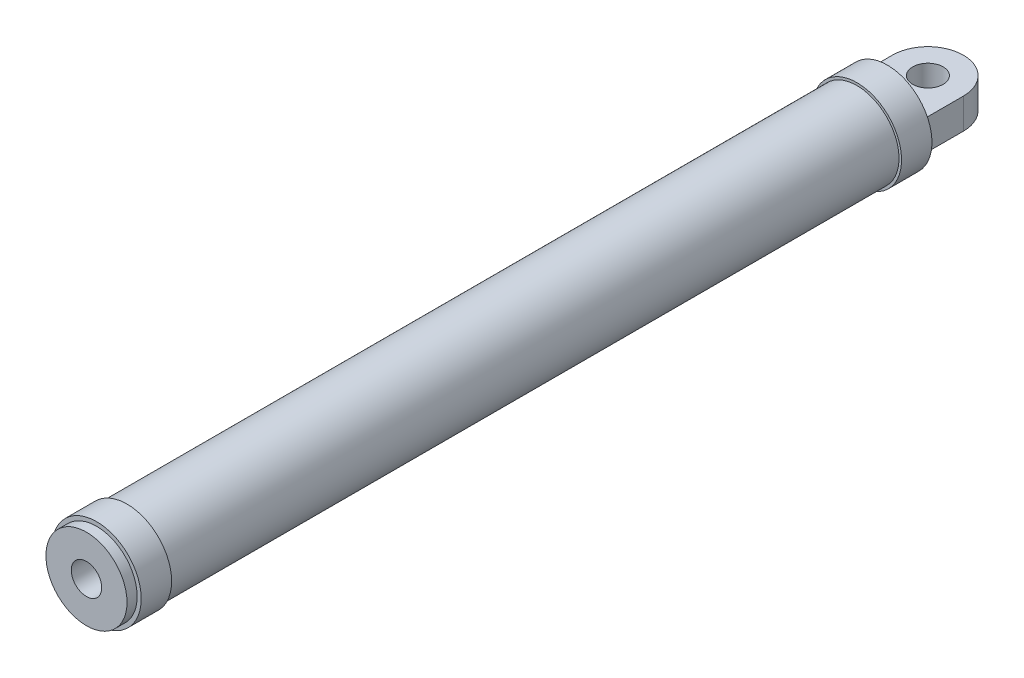
ISO-10303-21;
HEADER;
FILE_DESCRIPTION(('STEP AP214'),'2;1');
FILE_NAME('part.step','',(''),(''),'','','');
FILE_SCHEMA(('AUTOMOTIVE_DESIGN { 1 0 10303 214 1 1 1 1 }'));
ENDSEC;
DATA;
#1=APPLICATION_CONTEXT('core data for automotive mechanical design processes');
#2=APPLICATION_PROTOCOL_DEFINITION('international standard','automotive_design',2000,#1);
#3=PRODUCT_CONTEXT('',#1,'mechanical');
#4=PRODUCT('Part','Part','',(#3));
#5=PRODUCT_RELATED_PRODUCT_CATEGORY('part','',(#4));
#6=PRODUCT_DEFINITION_FORMATION('','',#4);
#7=PRODUCT_DEFINITION_CONTEXT('part definition',#1,'design');
#8=PRODUCT_DEFINITION('design','',#6,#7);
#9=PRODUCT_DEFINITION_SHAPE('','',#8);
#10=(LENGTH_UNIT() NAMED_UNIT(*) SI_UNIT(.MILLI.,.METRE.));
#11=(NAMED_UNIT(*) PLANE_ANGLE_UNIT() SI_UNIT($,.RADIAN.));
#12=(NAMED_UNIT(*) SI_UNIT($,.STERADIAN.) SOLID_ANGLE_UNIT());
#13=UNCERTAINTY_MEASURE_WITH_UNIT(LENGTH_MEASURE(1.E-05),#10,'distance_accuracy_value','');
#14=(GEOMETRIC_REPRESENTATION_CONTEXT(3) GLOBAL_UNCERTAINTY_ASSIGNED_CONTEXT((#13)) GLOBAL_UNIT_ASSIGNED_CONTEXT((#10,
#11,#12)) REPRESENTATION_CONTEXT('',''));
#15=CARTESIAN_POINT('',(0.,0.,0.));
#16=DIRECTION('',(0.,0.,1.));
#17=DIRECTION('',(1.,0.,0.));
#18=AXIS2_PLACEMENT_3D('',#15,#16,#17);
#19=CARTESIAN_POINT('',(0.,0.,-30.));
#20=DIRECTION('',(0.,0.,-1.));
#21=DIRECTION('',(-1.,0.,0.));
#22=AXIS2_PLACEMENT_3D('',#19,#20,#21);
#23=PLANE('',#22);
#24=CARTESIAN_POINT('',(0.,0.,-30.));
#25=DIRECTION('',(0.,0.,-1.));
#26=DIRECTION('',(-1.,0.,0.));
#27=AXIS2_PLACEMENT_3D('',#24,#25,#26);
#28=CIRCLE('',#27,44.);
#29=CARTESIAN_POINT('',(-44.,0.,-30.));
#30=VERTEX_POINT('',#29);
#31=EDGE_CURVE('E107',#30,#30,#28,.T.);
#32=ORIENTED_EDGE('',*,*,#31,.T.);
#33=EDGE_LOOP('',(#32));
#34=FACE_BOUND('',#33,.T.);
#35=DIRECTION('',(1.,0.,0.));
#36=VECTOR('',#35,1.);
#37=CARTESIAN_POINT('',(-35.,15.,-30.));
#38=LINE('',#37,#36);
#39=CARTESIAN_POINT('',(-35.,15.,-30.));
#40=VERTEX_POINT('',#39);
#41=CARTESIAN_POINT('',(35.,15.,-30.));
#42=VERTEX_POINT('',#41);
#43=EDGE_CURVE('E84',#40,#42,#38,.T.);
#44=ORIENTED_EDGE('',*,*,#43,.F.);
#45=DIRECTION('',(0.,-1.,0.));
#46=VECTOR('',#45,1.);
#47=CARTESIAN_POINT('',(-35.,15.,-30.));
#48=LINE('',#47,#46);
#49=CARTESIAN_POINT('',(-35.,-15.,-30.));
#50=VERTEX_POINT('',#49);
#51=EDGE_CURVE('E82',#40,#50,#48,.T.);
#52=ORIENTED_EDGE('',*,*,#51,.T.);
#53=DIRECTION('',(1.,0.,0.));
#54=VECTOR('',#53,1.);
#55=CARTESIAN_POINT('',(-35.,-15.,-30.));
#56=LINE('',#55,#54);
#57=CARTESIAN_POINT('',(35.,-15.,-30.));
#58=VERTEX_POINT('',#57);
#59=EDGE_CURVE('E210',#50,#58,#56,.T.);
#60=ORIENTED_EDGE('',*,*,#59,.T.);
#61=DIRECTION('',(0.,-1.,0.));
#62=VECTOR('',#61,1.);
#63=CARTESIAN_POINT('',(35.,15.,-30.));
#64=LINE('',#63,#62);
#65=EDGE_CURVE('E100',#42,#58,#64,.T.);
#66=ORIENTED_EDGE('',*,*,#65,.F.);
#67=EDGE_LOOP('',(#44,#52,#60,#66));
#68=FACE_BOUND('',#67,.T.);
#69=ADVANCED_FACE('F34',(#34,#68),#23,.T.);
#70=CARTESIAN_POINT('',(0.,0.,750.));
#71=DIRECTION('',(0.,0.,1.));
#72=DIRECTION('',(1.,0.,0.));
#73=AXIS2_PLACEMENT_3D('',#70,#71,#72);
#74=PLANE('',#73);
#75=CARTESIAN_POINT('',(0.,0.,750.));
#76=DIRECTION('',(0.,0.,1.));
#77=DIRECTION('',(1.,0.,0.));
#78=AXIS2_PLACEMENT_3D('',#75,#76,#77);
#79=CIRCLE('',#78,44.);
#80=CARTESIAN_POINT('',(44.,0.,750.));
#81=VERTEX_POINT('',#80);
#82=EDGE_CURVE('E42',#81,#81,#79,.T.);
#83=ORIENTED_EDGE('',*,*,#82,.T.);
#84=EDGE_LOOP('',(#83));
#85=FACE_BOUND('',#84,.T.);
#86=CARTESIAN_POINT('',(0.,0.,750.));
#87=DIRECTION('',(0.,0.,1.));
#88=DIRECTION('',(1.,0.,0.));
#89=AXIS2_PLACEMENT_3D('',#86,#87,#88);
#90=CIRCLE('',#89,40.);
#91=CARTESIAN_POINT('',(40.,0.,750.));
#92=VERTEX_POINT('',#91);
#93=EDGE_CURVE('E95',#92,#92,#90,.T.);
#94=ORIENTED_EDGE('',*,*,#93,.F.);
#95=EDGE_LOOP('',(#94));
#96=FACE_BOUND('',#95,.T.);
#97=ADVANCED_FACE('F130',(#85,#96),#74,.T.);
#98=CARTESIAN_POINT('',(0.,0.,720.));
#99=DIRECTION('',(0.,0.,-1.));
#100=DIRECTION('',(-1.,0.,0.));
#101=AXIS2_PLACEMENT_3D('',#98,#99,#100);
#102=CYLINDRICAL_SURFACE('',#101,41.5);
#103=CARTESIAN_POINT('',(0.,0.,720.));
#104=DIRECTION('',(0.,0.,1.));
#105=DIRECTION('',(1.,0.,0.));
#106=AXIS2_PLACEMENT_3D('',#103,#104,#105);
#107=CIRCLE('',#106,41.5);
#108=CARTESIAN_POINT('',(-41.5,0.,720.));
#109=VERTEX_POINT('',#108);
#110=EDGE_CURVE('E11',#109,#109,#107,.T.);
#111=CARTESIAN_POINT('',(0.,0.,0.));
#112=DIRECTION('',(0.,0.,-1.));
#113=DIRECTION('',(-1.,0.,0.));
#114=AXIS2_PLACEMENT_3D('',#111,#112,#113);
#115=CIRCLE('',#114,41.5);
#116=CARTESIAN_POINT('',(-41.5,0.,1.11022302462516E-13));
#117=VERTEX_POINT('',#116);
#118=EDGE_CURVE('E110',#117,#117,#115,.T.);
#119=CARTESIAN_POINT('',(-41.5,0.,720.));
#120=CARTESIAN_POINT('',(-41.5,0.,712.5));
#121=CARTESIAN_POINT('',(-41.5,0.,705.));
#122=CARTESIAN_POINT('',(-41.5,0.,690.));
#123=CARTESIAN_POINT('',(-41.5,0.,682.5));
#124=CARTESIAN_POINT('',(-41.5,0.,667.5));
#125=CARTESIAN_POINT('',(-41.5,0.,660.));
#126=CARTESIAN_POINT('',(-41.5,0.,645.));
#127=CARTESIAN_POINT('',(-41.5,0.,637.5));
#128=CARTESIAN_POINT('',(-41.5,0.,622.5));
#129=CARTESIAN_POINT('',(-41.5,0.,615.));
#130=CARTESIAN_POINT('',(-41.5,0.,600.));
#131=CARTESIAN_POINT('',(-41.5,0.,592.5));
#132=CARTESIAN_POINT('',(-41.5,0.,577.5));
#133=CARTESIAN_POINT('',(-41.5,0.,570.));
#134=CARTESIAN_POINT('',(-41.5,0.,555.));
#135=CARTESIAN_POINT('',(-41.5,0.,547.5));
#136=CARTESIAN_POINT('',(-41.5,0.,532.5));
#137=CARTESIAN_POINT('',(-41.5,0.,525.));
#138=CARTESIAN_POINT('',(-41.5,0.,510.));
#139=CARTESIAN_POINT('',(-41.5,0.,502.5));
#140=CARTESIAN_POINT('',(-41.5,0.,487.5));
#141=CARTESIAN_POINT('',(-41.5,0.,480.));
#142=CARTESIAN_POINT('',(-41.5,0.,465.));
#143=CARTESIAN_POINT('',(-41.5,0.,457.5));
#144=CARTESIAN_POINT('',(-41.5,0.,442.5));
#145=CARTESIAN_POINT('',(-41.5,0.,435.));
#146=CARTESIAN_POINT('',(-41.5,0.,420.));
#147=CARTESIAN_POINT('',(-41.5,0.,412.5));
#148=CARTESIAN_POINT('',(-41.5,0.,397.5));
#149=CARTESIAN_POINT('',(-41.5,0.,390.));
#150=CARTESIAN_POINT('',(-41.5,0.,375.));
#151=CARTESIAN_POINT('',(-41.5,0.,367.5));
#152=CARTESIAN_POINT('',(-41.5,0.,352.5));
#153=CARTESIAN_POINT('',(-41.5,0.,345.));
#154=CARTESIAN_POINT('',(-41.5,0.,330.));
#155=CARTESIAN_POINT('',(-41.5,0.,322.5));
#156=CARTESIAN_POINT('',(-41.5,0.,307.5));
#157=CARTESIAN_POINT('',(-41.5,0.,300.));
#158=CARTESIAN_POINT('',(-41.5,0.,285.));
#159=CARTESIAN_POINT('',(-41.5,0.,277.5));
#160=CARTESIAN_POINT('',(-41.5,0.,262.5));
#161=CARTESIAN_POINT('',(-41.5,0.,255.));
#162=CARTESIAN_POINT('',(-41.5,0.,240.));
#163=CARTESIAN_POINT('',(-41.5,0.,232.5));
#164=CARTESIAN_POINT('',(-41.5,0.,217.5));
#165=CARTESIAN_POINT('',(-41.5,0.,210.));
#166=CARTESIAN_POINT('',(-41.5,0.,195.));
#167=CARTESIAN_POINT('',(-41.5,0.,187.5));
#168=CARTESIAN_POINT('',(-41.5,0.,172.5));
#169=CARTESIAN_POINT('',(-41.5,0.,165.));
#170=CARTESIAN_POINT('',(-41.5,0.,150.));
#171=CARTESIAN_POINT('',(-41.5,0.,142.5));
#172=CARTESIAN_POINT('',(-41.5,0.,127.5));
#173=CARTESIAN_POINT('',(-41.5,0.,120.));
#174=CARTESIAN_POINT('',(-41.5,0.,105.));
#175=CARTESIAN_POINT('',(-41.5,0.,97.5000000000001));
#176=CARTESIAN_POINT('',(-41.5,0.,82.5000000000001));
#177=CARTESIAN_POINT('',(-41.5,0.,75.0000000000001));
#178=CARTESIAN_POINT('',(-41.5,0.,60.0000000000001));
#179=CARTESIAN_POINT('',(-41.5,0.,52.5000000000001));
#180=CARTESIAN_POINT('',(-41.5,0.,37.5000000000001));
#181=CARTESIAN_POINT('',(-41.5,0.,30.0000000000001));
#182=CARTESIAN_POINT('',(-41.5,0.,15.0000000000001));
#183=CARTESIAN_POINT('',(-41.5,0.,7.50000000000011));
#184=CARTESIAN_POINT('',(-41.5,0.,1.11022302462516E-13));
#185=B_SPLINE_CURVE_WITH_KNOTS('',3,(#119,#120,#121,#122,#123,#124,#125,#126,#127,#128,#129,
#130,#131,#132,#133,#134,#135,#136,#137,#138,#139,#140,#141,#142,#143,#144,#145,#146,#147,#148,
#149,#150,#151,#152,#153,#154,#155,#156,#157,#158,#159,#160,#161,#162,#163,#164,#165,#166,#167,
#168,#169,#170,#171,#172,#173,#174,#175,#176,#177,#178,#179,#180,#181,#182,#183,#184),
.UNSPECIFIED.,.F.,.F.,(4,2,2,2,2,2,2,2,2,2,2,2,2,2,2,2,2,2,2,2,2,2,2,2,2,2,2,2,2,2,2,2,4),(0.,
22.5000000000001,45.,67.5,90.0000000000001,112.5,135.,157.5,180.,202.5,225.,247.5,270.,292.5,
315.,337.5,360.,382.5,405.,427.5,450.,472.5,495.,517.5,540.,562.5,585.,607.5,630.,652.5,675.,
697.5,720.),.UNSPECIFIED.);
#186=EDGE_CURVE('BSEAM36',#109,#117,#185,.T.);
#187=ORIENTED_EDGE('',*,*,#110,.F.);
#188=ORIENTED_EDGE('',*,*,#118,.F.);
#189=ORIENTED_EDGE('',*,*,#186,.T.);
#190=ORIENTED_EDGE('',*,*,#186,.F.);
#191=EDGE_LOOP('',(#187,#189,#188,#190));
#192=FACE_BOUND('',#191,.T.);
#193=ADVANCED_FACE('F36',(#192),#102,.T.);
#194=CARTESIAN_POINT('',(0.,0.,720.));
#195=DIRECTION('',(0.,0.,1.));
#196=DIRECTION('',(1.,0.,0.));
#197=AXIS2_PLACEMENT_3D('',#194,#195,#196);
#198=PLANE('',#197);
#199=CARTESIAN_POINT('',(0.,0.,720.));
#200=DIRECTION('',(0.,0.,1.));
#201=DIRECTION('',(1.,0.,0.));
#202=AXIS2_PLACEMENT_3D('',#199,#200,#201);
#203=CIRCLE('',#202,44.);
#204=CARTESIAN_POINT('',(44.,0.,720.));
#205=VERTEX_POINT('',#204);
#206=EDGE_CURVE('E115',#205,#205,#203,.T.);
#207=ORIENTED_EDGE('',*,*,#206,.F.);
#208=EDGE_LOOP('',(#207));
#209=FACE_BOUND('',#208,.T.);
#210=ORIENTED_EDGE('',*,*,#110,.T.);
#211=EDGE_LOOP('',(#210));
#212=FACE_BOUND('',#211,.T.);
#213=ADVANCED_FACE('F122',(#209,#212),#198,.F.);
#214=CARTESIAN_POINT('',(0.,0.,750.));
#215=DIRECTION('',(0.,0.,-1.));
#216=DIRECTION('',(-1.,0.,0.));
#217=AXIS2_PLACEMENT_3D('',#214,#215,#216);
#218=CYLINDRICAL_SURFACE('',#217,44.);
#219=ORIENTED_EDGE('',*,*,#82,.F.);
#220=EDGE_LOOP('',(#219));
#221=FACE_BOUND('',#220,.T.);
#222=ORIENTED_EDGE('',*,*,#206,.T.);
#223=EDGE_LOOP('',(#222));
#224=FACE_BOUND('',#223,.T.);
#225=ADVANCED_FACE('F120',(#221,#224),#218,.T.);
#226=CARTESIAN_POINT('',(0.,0.,0.));
#227=DIRECTION('',(0.,0.,-1.));
#228=DIRECTION('',(-1.,0.,0.));
#229=AXIS2_PLACEMENT_3D('',#226,#227,#228);
#230=PLANE('',#229);
#231=CARTESIAN_POINT('',(0.,0.,0.));
#232=DIRECTION('',(0.,0.,-1.));
#233=DIRECTION('',(-1.,0.,0.));
#234=AXIS2_PLACEMENT_3D('',#231,#232,#233);
#235=CIRCLE('',#234,44.);
#236=CARTESIAN_POINT('',(-44.,0.,0.));
#237=VERTEX_POINT('',#236);
#238=EDGE_CURVE('E105',#237,#237,#235,.T.);
#239=ORIENTED_EDGE('',*,*,#238,.F.);
#240=EDGE_LOOP('',(#239));
#241=FACE_BOUND('',#240,.T.);
#242=ORIENTED_EDGE('',*,*,#118,.T.);
#243=EDGE_LOOP('',(#242));
#244=FACE_BOUND('',#243,.T.);
#245=ADVANCED_FACE('F133',(#241,#244),#230,.F.);
#246=CARTESIAN_POINT('',(0.,0.,-30.));
#247=DIRECTION('',(0.,0.,1.));
#248=DIRECTION('',(1.,0.,0.));
#249=AXIS2_PLACEMENT_3D('',#246,#247,#248);
#250=CYLINDRICAL_SURFACE('',#249,44.);
#251=ORIENTED_EDGE('',*,*,#31,.F.);
#252=EDGE_LOOP('',(#251));
#253=FACE_BOUND('',#252,.T.);
#254=ORIENTED_EDGE('',*,*,#238,.T.);
#255=EDGE_LOOP('',(#254));
#256=FACE_BOUND('',#255,.T.);
#257=ADVANCED_FACE('F135',(#253,#256),#250,.T.);
#258=CARTESIAN_POINT('',(0.,0.,760.));
#259=DIRECTION('',(0.,0.,-1.));
#260=DIRECTION('',(-1.,0.,0.));
#261=AXIS2_PLACEMENT_3D('',#258,#259,#260);
#262=CYLINDRICAL_SURFACE('',#261,40.);
#263=CARTESIAN_POINT('',(0.,0.,760.));
#264=DIRECTION('',(0.,0.,1.));
#265=DIRECTION('',(1.,0.,0.));
#266=AXIS2_PLACEMENT_3D('',#263,#264,#265);
#267=CIRCLE('',#266,40.);
#268=CARTESIAN_POINT('',(40.,0.,760.));
#269=VERTEX_POINT('',#268);
#270=EDGE_CURVE('E98',#269,#269,#267,.T.);
#271=ORIENTED_EDGE('',*,*,#270,.F.);
#272=EDGE_LOOP('',(#271));
#273=FACE_BOUND('',#272,.T.);
#274=ORIENTED_EDGE('',*,*,#93,.T.);
#275=EDGE_LOOP('',(#274));
#276=FACE_BOUND('',#275,.T.);
#277=ADVANCED_FACE('F142',(#273,#276),#262,.T.);
#278=CARTESIAN_POINT('',(0.,0.,760.));
#279=DIRECTION('',(0.,0.,1.));
#280=DIRECTION('',(1.,0.,0.));
#281=AXIS2_PLACEMENT_3D('',#278,#279,#280);
#282=PLANE('',#281);
#283=CARTESIAN_POINT('',(0.,0.,760.));
#284=DIRECTION('',(0.,0.,1.));
#285=DIRECTION('',(1.,0.,0.));
#286=AXIS2_PLACEMENT_3D('',#283,#284,#285);
#287=CIRCLE('',#286,15.);
#288=CARTESIAN_POINT('',(15.,0.,760.));
#289=VERTEX_POINT('',#288);
#290=EDGE_CURVE('E194',#289,#289,#287,.T.);
#291=ORIENTED_EDGE('',*,*,#290,.F.);
#292=EDGE_LOOP('',(#291));
#293=FACE_BOUND('',#292,.T.);
#294=ORIENTED_EDGE('',*,*,#270,.T.);
#295=EDGE_LOOP('',(#294));
#296=FACE_BOUND('',#295,.T.);
#297=ADVANCED_FACE('F159',(#293,#296),#282,.T.);
#298=CARTESIAN_POINT('',(0.,15.,-70.));
#299=DIRECTION('',(0.,1.,0.));
#300=DIRECTION('',(0.,0.,1.));
#301=AXIS2_PLACEMENT_3D('',#298,#299,#300);
#302=PLANE('',#301);
#303=CARTESIAN_POINT('',(0.,15.,-70.));
#304=DIRECTION('',(0.,1.,0.));
#305=DIRECTION('',(0.,0.,1.));
#306=AXIS2_PLACEMENT_3D('',#303,#304,#305);
#307=CIRCLE('',#306,35.);
#308=CARTESIAN_POINT('',(35.,15.,-70.));
#309=VERTEX_POINT('',#308);
#310=CARTESIAN_POINT('',(-35.,15.,-70.));
#311=VERTEX_POINT('',#310);
#312=EDGE_CURVE('E85',#309,#311,#307,.T.);
#313=ORIENTED_EDGE('',*,*,#312,.T.);
#314=DIRECTION('',(0.,0.,1.));
#315=VECTOR('',#314,1.);
#316=CARTESIAN_POINT('',(-35.,15.,-70.));
#317=LINE('',#316,#315);
#318=EDGE_CURVE('E76',#311,#40,#317,.T.);
#319=ORIENTED_EDGE('',*,*,#318,.T.);
#320=ORIENTED_EDGE('',*,*,#43,.T.);
#321=DIRECTION('',(0.,0.,-1.));
#322=VECTOR('',#321,1.);
#323=CARTESIAN_POINT('',(35.,15.,-30.));
#324=LINE('',#323,#322);
#325=EDGE_CURVE('E49',#42,#309,#324,.T.);
#326=ORIENTED_EDGE('',*,*,#325,.T.);
#327=EDGE_LOOP('',(#313,#319,#320,#326));
#328=FACE_BOUND('',#327,.T.);
#329=CARTESIAN_POINT('',(0.,15.,-70.));
#330=DIRECTION('',(0.,1.,0.));
#331=DIRECTION('',(0.,0.,1.));
#332=AXIS2_PLACEMENT_3D('',#329,#330,#331);
#333=CIRCLE('',#332,15.);
#334=CARTESIAN_POINT('',(0.,15.,-55.));
#335=VERTEX_POINT('',#334);
#336=EDGE_CURVE('E197',#335,#335,#333,.T.);
#337=ORIENTED_EDGE('',*,*,#336,.F.);
#338=EDGE_LOOP('',(#337));
#339=FACE_BOUND('',#338,.T.);
#340=ADVANCED_FACE('F88',(#328,#339),#302,.T.);
#341=CARTESIAN_POINT('',(0.,-15.,-70.));
#342=DIRECTION('',(0.,1.,0.));
#343=DIRECTION('',(0.,0.,1.));
#344=AXIS2_PLACEMENT_3D('',#341,#342,#343);
#345=PLANE('',#344);
#346=CARTESIAN_POINT('',(0.,-15.,-70.));
#347=DIRECTION('',(0.,1.,0.));
#348=DIRECTION('',(0.,0.,1.));
#349=AXIS2_PLACEMENT_3D('',#346,#347,#348);
#350=CIRCLE('',#349,35.);
#351=CARTESIAN_POINT('',(35.,-15.,-70.));
#352=VERTEX_POINT('',#351);
#353=CARTESIAN_POINT('',(-35.,-15.,-70.));
#354=VERTEX_POINT('',#353);
#355=EDGE_CURVE('E94',#352,#354,#350,.T.);
#356=ORIENTED_EDGE('',*,*,#355,.F.);
#357=DIRECTION('',(0.,0.,-1.));
#358=VECTOR('',#357,1.);
#359=CARTESIAN_POINT('',(35.,-15.,-30.));
#360=LINE('',#359,#358);
#361=EDGE_CURVE('E70',#58,#352,#360,.T.);
#362=ORIENTED_EDGE('',*,*,#361,.F.);
#363=ORIENTED_EDGE('',*,*,#59,.F.);
#364=DIRECTION('',(0.,0.,1.));
#365=VECTOR('',#364,1.);
#366=CARTESIAN_POINT('',(-35.,-15.,-70.));
#367=LINE('',#366,#365);
#368=EDGE_CURVE('E208',#354,#50,#367,.T.);
#369=ORIENTED_EDGE('',*,*,#368,.F.);
#370=EDGE_LOOP('',(#356,#362,#363,#369));
#371=FACE_BOUND('',#370,.T.);
#372=CARTESIAN_POINT('',(0.,-15.,-70.));
#373=DIRECTION('',(0.,1.,0.));
#374=DIRECTION('',(0.,0.,1.));
#375=AXIS2_PLACEMENT_3D('',#372,#373,#374);
#376=CIRCLE('',#375,15.);
#377=CARTESIAN_POINT('',(0.,-15.,-55.));
#378=VERTEX_POINT('',#377);
#379=EDGE_CURVE('E193',#378,#378,#376,.T.);
#380=ORIENTED_EDGE('',*,*,#379,.T.);
#381=EDGE_LOOP('',(#380));
#382=FACE_BOUND('',#381,.T.);
#383=ADVANCED_FACE('F166',(#371,#382),#345,.F.);
#384=CARTESIAN_POINT('',(0.,15.,-70.));
#385=DIRECTION('',(0.,-1.,0.));
#386=DIRECTION('',(0.,0.,-1.));
#387=AXIS2_PLACEMENT_3D('',#384,#385,#386);
#388=CYLINDRICAL_SURFACE('',#387,35.);
#389=ORIENTED_EDGE('',*,*,#355,.T.);
#390=DIRECTION('',(0.,-1.,0.));
#391=VECTOR('',#390,1.);
#392=CARTESIAN_POINT('',(-35.,15.,-70.));
#393=LINE('',#392,#391);
#394=EDGE_CURVE('E79',#311,#354,#393,.T.);
#395=ORIENTED_EDGE('',*,*,#394,.F.);
#396=ORIENTED_EDGE('',*,*,#312,.F.);
#397=DIRECTION('',(0.,-1.,0.));
#398=VECTOR('',#397,1.);
#399=CARTESIAN_POINT('',(35.,15.,-70.));
#400=LINE('',#399,#398);
#401=EDGE_CURVE('E206',#309,#352,#400,.T.);
#402=ORIENTED_EDGE('',*,*,#401,.T.);
#403=EDGE_LOOP('',(#389,#395,#396,#402));
#404=FACE_BOUND('',#403,.T.);
#405=ADVANCED_FACE('F92',(#404),#388,.T.);
#406=CARTESIAN_POINT('',(-35.,15.,-70.));
#407=DIRECTION('',(1.,0.,0.));
#408=DIRECTION('',(0.,0.,-1.));
#409=AXIS2_PLACEMENT_3D('',#406,#407,#408);
#410=PLANE('',#409);
#411=ORIENTED_EDGE('',*,*,#368,.T.);
#412=ORIENTED_EDGE('',*,*,#51,.F.);
#413=ORIENTED_EDGE('',*,*,#318,.F.);
#414=ORIENTED_EDGE('',*,*,#394,.T.);
#415=EDGE_LOOP('',(#411,#412,#413,#414));
#416=FACE_BOUND('',#415,.T.);
#417=ADVANCED_FACE('F77',(#416),#410,.F.);
#418=CARTESIAN_POINT('',(35.,15.,-30.));
#419=DIRECTION('',(-1.,0.,0.));
#420=DIRECTION('',(0.,0.,1.));
#421=AXIS2_PLACEMENT_3D('',#418,#419,#420);
#422=PLANE('',#421);
#423=ORIENTED_EDGE('',*,*,#361,.T.);
#424=ORIENTED_EDGE('',*,*,#401,.F.);
#425=ORIENTED_EDGE('',*,*,#325,.F.);
#426=ORIENTED_EDGE('',*,*,#65,.T.);
#427=EDGE_LOOP('',(#423,#424,#425,#426));
#428=FACE_BOUND('',#427,.T.);
#429=ADVANCED_FACE('F169',(#428),#422,.F.);
#430=CARTESIAN_POINT('',(0.,15.,-70.));
#431=DIRECTION('',(0.,-1.,0.));
#432=DIRECTION('',(0.,0.,-1.));
#433=AXIS2_PLACEMENT_3D('',#430,#431,#432);
#434=CYLINDRICAL_SURFACE('',#433,15.);
#435=ORIENTED_EDGE('',*,*,#336,.T.);
#436=EDGE_LOOP('',(#435));
#437=FACE_BOUND('',#436,.T.);
#438=ORIENTED_EDGE('',*,*,#379,.F.);
#439=EDGE_LOOP('',(#438));
#440=FACE_BOUND('',#439,.T.);
#441=ADVANCED_FACE('F172',(#437,#440),#434,.F.);
#442=CARTESIAN_POINT('',(0.,0.,540.));
#443=DIRECTION('',(0.,0.,1.));
#444=DIRECTION('',(1.,0.,0.));
#445=AXIS2_PLACEMENT_3D('',#442,#443,#444);
#446=CYLINDRICAL_SURFACE('',#445,15.);
#447=CARTESIAN_POINT('',(0.,0.,540.));
#448=DIRECTION('',(0.,0.,1.));
#449=DIRECTION('',(1.,0.,0.));
#450=AXIS2_PLACEMENT_3D('',#447,#448,#449);
#451=CIRCLE('',#450,15.);
#452=CARTESIAN_POINT('',(15.,0.,540.));
#453=VERTEX_POINT('',#452);
#454=EDGE_CURVE('E192',#453,#453,#451,.T.);
#455=ORIENTED_EDGE('',*,*,#454,.F.);
#456=EDGE_LOOP('',(#455));
#457=FACE_BOUND('',#456,.T.);
#458=ORIENTED_EDGE('',*,*,#290,.T.);
#459=EDGE_LOOP('',(#458));
#460=FACE_BOUND('',#459,.T.);
#461=ADVANCED_FACE('F180',(#457,#460),#446,.F.);
#462=CARTESIAN_POINT('',(0.,0.,540.));
#463=DIRECTION('',(0.,0.,1.));
#464=DIRECTION('',(1.,0.,0.));
#465=AXIS2_PLACEMENT_3D('',#462,#463,#464);
#466=PLANE('',#465);
#467=ORIENTED_EDGE('',*,*,#454,.T.);
#468=EDGE_LOOP('',(#467));
#469=FACE_BOUND('',#468,.T.);
#470=ADVANCED_FACE('F184',(#469),#466,.T.);
#471=CLOSED_SHELL('',(#69,#97,#193,#213,#225,#245,#257,#277,#297,#340,#383,#405,#417,#429,#441,
#461,#470));
#472=MANIFOLD_SOLID_BREP('B2',#471);
#473=ADVANCED_BREP_SHAPE_REPRESENTATION('',(#18,#472),#14);
#474=SHAPE_DEFINITION_REPRESENTATION(#9,#473);
ENDSEC;
END-ISO-10303-21;
